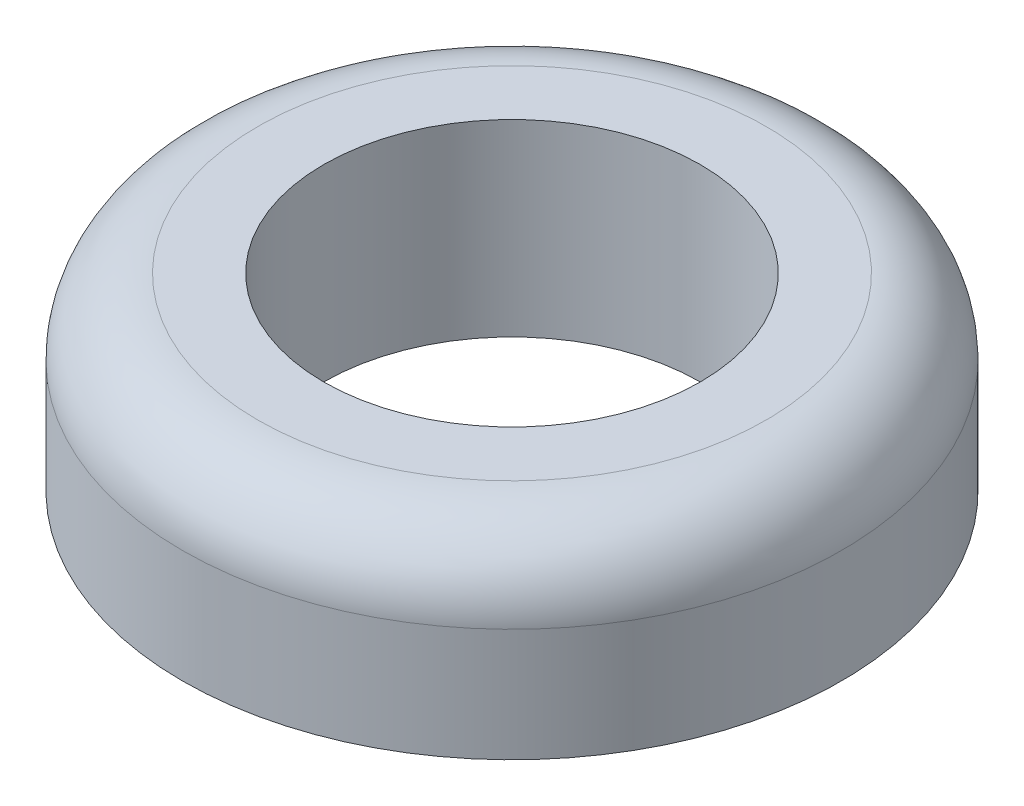
ISO-10303-21;
HEADER;
FILE_DESCRIPTION(('STEP AP214'),'2;1');
FILE_NAME('part.step','',(''),(''),'','','');
FILE_SCHEMA(('AUTOMOTIVE_DESIGN { 1 0 10303 214 1 1 1 1 }'));
ENDSEC;
DATA;
#1=APPLICATION_CONTEXT('core data for automotive mechanical design processes');
#2=APPLICATION_PROTOCOL_DEFINITION('international standard','automotive_design',2000,#1);
#3=PRODUCT_CONTEXT('',#1,'mechanical');
#4=PRODUCT('Part','Part','',(#3));
#5=PRODUCT_RELATED_PRODUCT_CATEGORY('part','',(#4));
#6=PRODUCT_DEFINITION_FORMATION('','',#4);
#7=PRODUCT_DEFINITION_CONTEXT('part definition',#1,'design');
#8=PRODUCT_DEFINITION('design','',#6,#7);
#9=PRODUCT_DEFINITION_SHAPE('','',#8);
#10=(LENGTH_UNIT() NAMED_UNIT(*) SI_UNIT(.MILLI.,.METRE.));
#11=(NAMED_UNIT(*) PLANE_ANGLE_UNIT() SI_UNIT($,.RADIAN.));
#12=(NAMED_UNIT(*) SI_UNIT($,.STERADIAN.) SOLID_ANGLE_UNIT());
#13=UNCERTAINTY_MEASURE_WITH_UNIT(LENGTH_MEASURE(1.E-05),#10,'distance_accuracy_value','');
#14=(GEOMETRIC_REPRESENTATION_CONTEXT(3) GLOBAL_UNCERTAINTY_ASSIGNED_CONTEXT((#13)) GLOBAL_UNIT_ASSIGNED_CONTEXT((#10,
#11,#12)) REPRESENTATION_CONTEXT('',''));
#15=CARTESIAN_POINT('',(0.,0.,0.));
#16=DIRECTION('',(0.,0.,1.));
#17=DIRECTION('',(1.,0.,0.));
#18=AXIS2_PLACEMENT_3D('',#15,#16,#17);
#19=CARTESIAN_POINT('',(0.,1.,0.));
#20=DIRECTION('',(0.,1.,0.));
#21=DIRECTION('',(0.,0.,1.));
#22=AXIS2_PLACEMENT_3D('',#19,#20,#21);
#23=PLANE('',#22);
#24=CARTESIAN_POINT('',(0.,1.,0.));
#25=DIRECTION('',(0.,1.,0.));
#26=DIRECTION('',(0.,0.,1.));
#27=AXIS2_PLACEMENT_3D('',#24,#25,#26);
#28=CIRCLE('',#27,1.35);
#29=CARTESIAN_POINT('',(0.,1.,1.35));
#30=VERTEX_POINT('',#29);
#31=EDGE_CURVE('E41',#30,#30,#28,.T.);
#32=ORIENTED_EDGE('',*,*,#31,.T.);
#33=EDGE_LOOP('',(#32));
#34=FACE_BOUND('',#33,.T.);
#35=CARTESIAN_POINT('',(0.,1.,0.));
#36=DIRECTION('',(0.,1.,0.));
#37=DIRECTION('',(0.,0.,1.));
#38=AXIS2_PLACEMENT_3D('',#35,#36,#37);
#39=CIRCLE('',#38,1.);
#40=CARTESIAN_POINT('',(0.,1.,1.));
#41=VERTEX_POINT('',#40);
#42=EDGE_CURVE('E49',#41,#41,#39,.T.);
#43=ORIENTED_EDGE('',*,*,#42,.F.);
#44=EDGE_LOOP('',(#43));
#45=FACE_BOUND('',#44,.T.);
#46=ADVANCED_FACE('F34',(#34,#45),#23,.T.);
#47=CARTESIAN_POINT('',(0.,0.,0.));
#48=DIRECTION('',(0.,1.,0.));
#49=DIRECTION('',(0.,0.,1.));
#50=AXIS2_PLACEMENT_3D('',#47,#48,#49);
#51=PLANE('',#50);
#52=CARTESIAN_POINT('',(0.,0.,0.));
#53=DIRECTION('',(0.,1.,0.));
#54=DIRECTION('',(0.,0.,1.));
#55=AXIS2_PLACEMENT_3D('',#52,#53,#54);
#56=CIRCLE('',#55,1.75);
#57=CARTESIAN_POINT('',(0.,0.,1.75));
#58=VERTEX_POINT('',#57);
#59=EDGE_CURVE('E45',#58,#58,#56,.T.);
#60=ORIENTED_EDGE('',*,*,#59,.F.);
#61=EDGE_LOOP('',(#60));
#62=FACE_BOUND('',#61,.T.);
#63=CARTESIAN_POINT('',(0.,0.,0.));
#64=DIRECTION('',(0.,1.,0.));
#65=DIRECTION('',(0.,0.,1.));
#66=AXIS2_PLACEMENT_3D('',#63,#64,#65);
#67=CIRCLE('',#66,1.);
#68=CARTESIAN_POINT('',(0.,0.,1.));
#69=VERTEX_POINT('',#68);
#70=EDGE_CURVE('E52',#69,#69,#67,.T.);
#71=ORIENTED_EDGE('',*,*,#70,.T.);
#72=EDGE_LOOP('',(#71));
#73=FACE_BOUND('',#72,.T.);
#74=ADVANCED_FACE('F62',(#62,#73),#51,.F.);
#75=CARTESIAN_POINT('',(0.,1.,0.));
#76=DIRECTION('',(0.,-1.,0.));
#77=DIRECTION('',(0.,0.,-1.));
#78=AXIS2_PLACEMENT_3D('',#75,#76,#77);
#79=CYLINDRICAL_SURFACE('',#78,1.75);
#80=CARTESIAN_POINT('',(0.,0.6,0.));
#81=DIRECTION('',(0.,1.,0.));
#82=DIRECTION('',(0.,0.,1.));
#83=AXIS2_PLACEMENT_3D('',#80,#81,#82);
#84=CIRCLE('',#83,1.75);
#85=CARTESIAN_POINT('',(0.,0.6,1.75));
#86=VERTEX_POINT('',#85);
#87=EDGE_CURVE('E10',#86,#86,#84,.F.);
#88=ORIENTED_EDGE('',*,*,#87,.T.);
#89=EDGE_LOOP('',(#88));
#90=FACE_BOUND('',#89,.T.);
#91=ORIENTED_EDGE('',*,*,#59,.T.);
#92=EDGE_LOOP('',(#91));
#93=FACE_BOUND('',#92,.T.);
#94=ADVANCED_FACE('F67',(#90,#93),#79,.T.);
#95=CARTESIAN_POINT('',(0.,1.,0.));
#96=DIRECTION('',(0.,-1.,0.));
#97=DIRECTION('',(0.,0.,-1.));
#98=AXIS2_PLACEMENT_3D('',#95,#96,#97);
#99=CYLINDRICAL_SURFACE('',#98,1.);
#100=ORIENTED_EDGE('',*,*,#42,.T.);
#101=EDGE_LOOP('',(#100));
#102=FACE_BOUND('',#101,.T.);
#103=ORIENTED_EDGE('',*,*,#70,.F.);
#104=EDGE_LOOP('',(#103));
#105=FACE_BOUND('',#104,.T.);
#106=ADVANCED_FACE('F58',(#102,#105),#99,.F.);
#107=CARTESIAN_POINT('',(0.,0.6,0.));
#108=DIRECTION('',(0.,1.,0.));
#109=DIRECTION('',(0.,0.,1.));
#110=AXIS2_PLACEMENT_3D('',#107,#108,#109);
#111=TOROIDAL_SURFACE('',#110,1.35,0.4);
#112=ORIENTED_EDGE('',*,*,#87,.F.);
#113=EDGE_LOOP('',(#112));
#114=FACE_BOUND('',#113,.T.);
#115=ORIENTED_EDGE('',*,*,#31,.F.);
#116=EDGE_LOOP('',(#115));
#117=FACE_BOUND('',#116,.T.);
#118=ADVANCED_FACE('F36',(#114,#117),#111,.T.);
#119=CLOSED_SHELL('',(#46,#74,#94,#106,#118));
#120=MANIFOLD_SOLID_BREP('B2',#119);
#121=ADVANCED_BREP_SHAPE_REPRESENTATION('',(#18,#120),#14);
#122=SHAPE_DEFINITION_REPRESENTATION(#9,#121);
ENDSEC;
END-ISO-10303-21;
